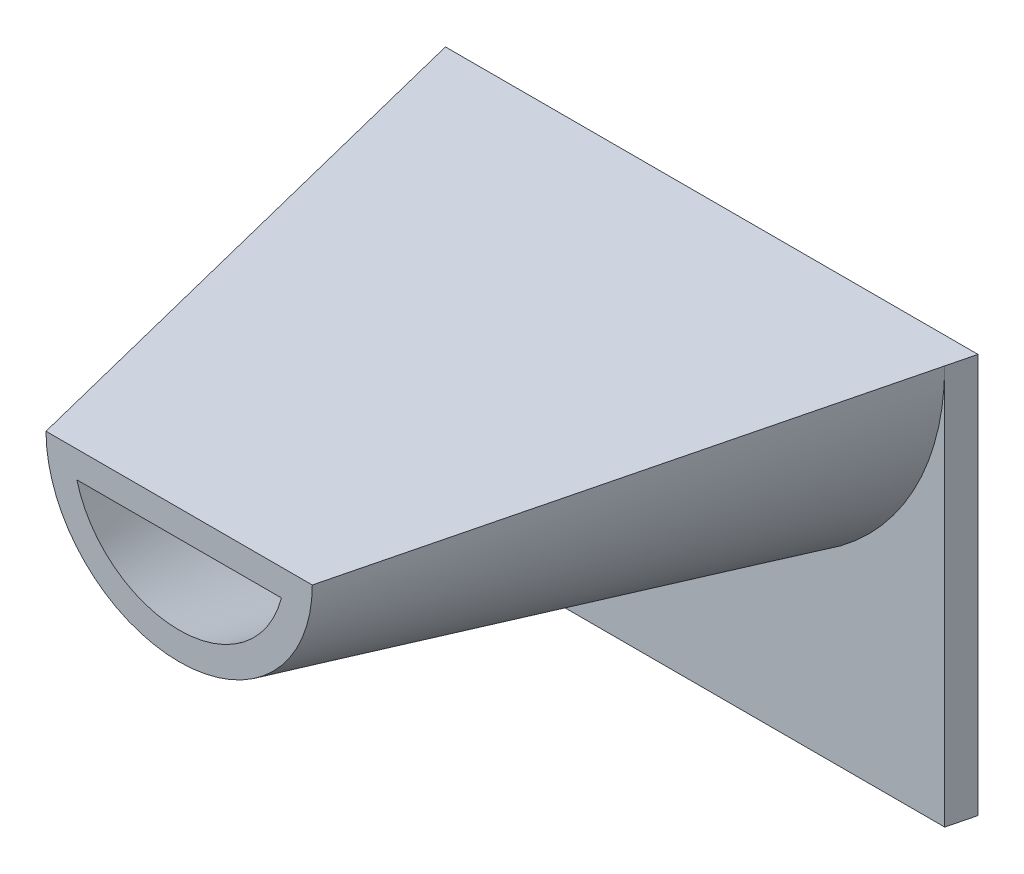
ISO-10303-21;
HEADER;
FILE_DESCRIPTION(('STEP AP214'),'2;1');
FILE_NAME('part.step','',(''),(''),'','','');
FILE_SCHEMA(('AUTOMOTIVE_DESIGN { 1 0 10303 214 1 1 1 1 }'));
ENDSEC;
DATA;
#1=APPLICATION_CONTEXT('core data for automotive mechanical design processes');
#2=APPLICATION_PROTOCOL_DEFINITION('international standard','automotive_design',2000,#1);
#3=PRODUCT_CONTEXT('',#1,'mechanical');
#4=PRODUCT('Part','Part','',(#3));
#5=PRODUCT_RELATED_PRODUCT_CATEGORY('part','',(#4));
#6=PRODUCT_DEFINITION_FORMATION('','',#4);
#7=PRODUCT_DEFINITION_CONTEXT('part definition',#1,'design');
#8=PRODUCT_DEFINITION('design','',#6,#7);
#9=PRODUCT_DEFINITION_SHAPE('','',#8);
#10=(LENGTH_UNIT() NAMED_UNIT(*) SI_UNIT(.MILLI.,.METRE.));
#11=(NAMED_UNIT(*) PLANE_ANGLE_UNIT() SI_UNIT($,.RADIAN.));
#12=(NAMED_UNIT(*) SI_UNIT($,.STERADIAN.) SOLID_ANGLE_UNIT());
#13=UNCERTAINTY_MEASURE_WITH_UNIT(LENGTH_MEASURE(1.E-05),#10,'distance_accuracy_value','');
#14=(GEOMETRIC_REPRESENTATION_CONTEXT(3) GLOBAL_UNCERTAINTY_ASSIGNED_CONTEXT((#13)) GLOBAL_UNIT_ASSIGNED_CONTEXT((#10,
#11,#12)) REPRESENTATION_CONTEXT('',''));
#15=CARTESIAN_POINT('',(0.,0.,0.));
#16=DIRECTION('',(0.,0.,1.));
#17=DIRECTION('',(1.,0.,0.));
#18=AXIS2_PLACEMENT_3D('',#15,#16,#17);
#19=CARTESIAN_POINT('',(0.,-15.,0.));
#20=DIRECTION('',(0.,1.,0.));
#21=DIRECTION('',(1.,0.,0.));
#22=AXIS2_PLACEMENT_3D('',#19,#20,#21);
#23=PLANE('',#22);
#24=DIRECTION('',(1.,0.,0.));
#25=VECTOR('',#24,1.);
#26=CARTESIAN_POINT('',(0.,-15.,1.));
#27=LINE('',#26,#25);
#28=CARTESIAN_POINT('',(-9.75,-15.,1.));
#29=VERTEX_POINT('',#28);
#30=CARTESIAN_POINT('',(9.75,-15.,1.));
#31=VERTEX_POINT('',#30);
#32=EDGE_CURVE('E240',#29,#31,#27,.T.);
#33=ORIENTED_EDGE('',*,*,#32,.F.);
#34=DIRECTION('',(0.242535625036332,0.,0.970142500145332));
#35=VECTOR('',#34,1.);
#36=CARTESIAN_POINT('',(-10.,-15.,0.));
#37=LINE('',#36,#35);
#38=CARTESIAN_POINT('',(-10.,-15.,0.));
#39=VERTEX_POINT('',#38);
#40=EDGE_CURVE('E10',#39,#29,#37,.T.);
#41=ORIENTED_EDGE('',*,*,#40,.F.);
#42=DIRECTION('',(-1.,0.,0.));
#43=VECTOR('',#42,1.);
#44=CARTESIAN_POINT('',(10.,-15.,0.));
#45=LINE('',#44,#43);
#46=CARTESIAN_POINT('',(10.,-15.,0.));
#47=VERTEX_POINT('',#46);
#48=EDGE_CURVE('E234',#47,#39,#45,.T.);
#49=ORIENTED_EDGE('',*,*,#48,.F.);
#50=DIRECTION('',(0.242535625036336,0.,-0.970142500145331));
#51=VECTOR('',#50,1.);
#52=CARTESIAN_POINT('',(9.75,-15.,1.));
#53=LINE('',#52,#51);
#54=EDGE_CURVE('E28',#31,#47,#53,.T.);
#55=ORIENTED_EDGE('',*,*,#54,.F.);
#56=EDGE_LOOP('',(#33,#41,#49,#55));
#57=FACE_BOUND('',#56,.T.);
#58=ADVANCED_FACE('F15',(#57),#23,.F.);
#59=CARTESIAN_POINT('',(-10.,-15.,0.));
#60=DIRECTION('',(-0.970142500145332,0.,0.242535625036332));
#61=DIRECTION('',(0.,1.,0.));
#62=AXIS2_PLACEMENT_3D('',#59,#60,#61);
#63=PLANE('',#62);
#64=DIRECTION('',(0.242535625036333,0.,0.970142500145332));
#65=VECTOR('',#64,1.);
#66=CARTESIAN_POINT('',(0.,0.,40.));
#67=LINE('',#66,#65);
#68=CARTESIAN_POINT('',(-10.,0.,0.));
#69=VERTEX_POINT('',#68);
#70=CARTESIAN_POINT('',(-9.75,0.,1.));
#71=VERTEX_POINT('',#70);
#72=EDGE_CURVE('E92',#69,#71,#67,.T.);
#73=ORIENTED_EDGE('',*,*,#72,.F.);
#74=DIRECTION('',(0.,1.,0.));
#75=VECTOR('',#74,1.);
#76=CARTESIAN_POINT('',(-10.,-15.,0.));
#77=LINE('',#76,#75);
#78=EDGE_CURVE('E229',#39,#69,#77,.T.);
#79=ORIENTED_EDGE('',*,*,#78,.F.);
#80=ORIENTED_EDGE('',*,*,#40,.T.);
#81=DIRECTION('',(0.,1.,0.));
#82=VECTOR('',#81,1.);
#83=CARTESIAN_POINT('',(-9.75,-15.,1.));
#84=LINE('',#83,#82);
#85=EDGE_CURVE('E244',#29,#71,#84,.T.);
#86=ORIENTED_EDGE('',*,*,#85,.T.);
#87=EDGE_LOOP('',(#73,#79,#80,#86));
#88=FACE_BOUND('',#87,.T.);
#89=ADVANCED_FACE('F196',(#88),#63,.T.);
#90=CARTESIAN_POINT('',(9.75,-15.,1.));
#91=DIRECTION('',(0.970142500145331,0.,0.242535625036335));
#92=DIRECTION('',(0.,-1.,0.));
#93=AXIS2_PLACEMENT_3D('',#90,#91,#92);
#94=PLANE('',#93);
#95=DIRECTION('',(0.242535625036336,0.,-0.970142500145331));
#96=VECTOR('',#95,1.);
#97=CARTESIAN_POINT('',(9.75,0.,1.));
#98=LINE('',#97,#96);
#99=CARTESIAN_POINT('',(9.75,0.,1.));
#100=VERTEX_POINT('',#99);
#101=CARTESIAN_POINT('',(10.,0.,0.));
#102=VERTEX_POINT('',#101);
#103=EDGE_CURVE('E83',#100,#102,#98,.T.);
#104=ORIENTED_EDGE('',*,*,#103,.F.);
#105=DIRECTION('',(0.,1.,0.));
#106=VECTOR('',#105,1.);
#107=CARTESIAN_POINT('',(9.75,-15.,1.));
#108=LINE('',#107,#106);
#109=EDGE_CURVE('E211',#31,#100,#108,.T.);
#110=ORIENTED_EDGE('',*,*,#109,.F.);
#111=ORIENTED_EDGE('',*,*,#54,.T.);
#112=DIRECTION('',(0.,1.,0.));
#113=VECTOR('',#112,1.);
#114=CARTESIAN_POINT('',(10.,-15.,0.));
#115=LINE('',#114,#113);
#116=EDGE_CURVE('E213',#47,#102,#115,.T.);
#117=ORIENTED_EDGE('',*,*,#116,.T.);
#118=EDGE_LOOP('',(#104,#110,#111,#117));
#119=FACE_BOUND('',#118,.T.);
#120=ADVANCED_FACE('F202',(#119),#94,.T.);
#121=CARTESIAN_POINT('',(0.,-15.,1.));
#122=DIRECTION('',(0.,0.,1.));
#123=DIRECTION('',(1.,0.,0.));
#124=AXIS2_PLACEMENT_3D('',#121,#122,#123);
#125=PLANE('',#124);
#126=ORIENTED_EDGE('',*,*,#109,.T.);
#127=CARTESIAN_POINT('',(0.,0.,1.));
#128=DIRECTION('',(0.,0.,-1.));
#129=DIRECTION('',(1.,0.,0.));
#130=AXIS2_PLACEMENT_3D('',#127,#128,#129);
#131=CIRCLE('',#130,9.75);
#132=EDGE_CURVE('E224',#100,#71,#131,.T.);
#133=ORIENTED_EDGE('',*,*,#132,.T.);
#134=ORIENTED_EDGE('',*,*,#85,.F.);
#135=ORIENTED_EDGE('',*,*,#32,.T.);
#136=EDGE_LOOP('',(#126,#133,#134,#135));
#137=FACE_BOUND('',#136,.T.);
#138=ADVANCED_FACE('F152',(#137),#125,.T.);
#139=CARTESIAN_POINT('',(0.,0.,31.5789629150842));
#140=DIRECTION('',(0.,-1.,0.));
#141=DIRECTION('',(0.,0.,-1.));
#142=AXIS2_PLACEMENT_3D('',#139,#140,#141);
#143=PLANE('',#142);
#144=ORIENTED_EDGE('',*,*,#72,.T.);
#145=DIRECTION('',(0.242535625036333,0.,0.970142500145332));
#146=VECTOR('',#145,1.);
#147=CARTESIAN_POINT('',(0.,0.,40.));
#148=LINE('',#147,#146);
#149=CARTESIAN_POINT('',(-5.,0.,20.));
#150=VERTEX_POINT('',#149);
#151=EDGE_CURVE('E223',#71,#150,#148,.T.);
#152=ORIENTED_EDGE('',*,*,#151,.T.);
#153=DIRECTION('',(-1.,0.,0.));
#154=VECTOR('',#153,1.);
#155=CARTESIAN_POINT('',(0.,0.,20.));
#156=LINE('',#155,#154);
#157=CARTESIAN_POINT('',(5.,0.,20.));
#158=VERTEX_POINT('',#157);
#159=EDGE_CURVE('E173',#158,#150,#156,.T.);
#160=ORIENTED_EDGE('',*,*,#159,.F.);
#161=DIRECTION('',(0.242535625036333,0.,-0.970142500145332));
#162=VECTOR('',#161,1.);
#163=CARTESIAN_POINT('',(0.,0.,40.));
#164=LINE('',#163,#162);
#165=EDGE_CURVE('E217',#158,#100,#164,.T.);
#166=ORIENTED_EDGE('',*,*,#165,.T.);
#167=ORIENTED_EDGE('',*,*,#103,.T.);
#168=DIRECTION('',(-1.,0.,0.));
#169=VECTOR('',#168,1.);
#170=CARTESIAN_POINT('',(2.34641638225249,0.,0.));
#171=LINE('',#170,#169);
#172=EDGE_CURVE('E258',#102,#69,#171,.T.);
#173=ORIENTED_EDGE('',*,*,#172,.T.);
#174=EDGE_LOOP('',(#144,#152,#160,#166,#167,#173));
#175=FACE_BOUND('',#174,.T.);
#176=ADVANCED_FACE('F192',(#175),#143,.F.);
#177=CARTESIAN_POINT('',(0.,0.,20.));
#178=DIRECTION('',(0.,0.,-1.));
#179=DIRECTION('',(-1.,0.,0.));
#180=AXIS2_PLACEMENT_3D('',#177,#178,#179);
#181=CONICAL_SURFACE('',#180,5.,0.244978663126864);
#182=ORIENTED_EDGE('',*,*,#132,.F.);
#183=ORIENTED_EDGE('',*,*,#165,.F.);
#184=CARTESIAN_POINT('',(0.,0.,20.));
#185=DIRECTION('',(0.,0.,-1.));
#186=DIRECTION('',(1.,0.,0.));
#187=AXIS2_PLACEMENT_3D('',#184,#185,#186);
#188=CIRCLE('',#187,5.);
#189=EDGE_CURVE('E247',#158,#150,#188,.T.);
#190=ORIENTED_EDGE('',*,*,#189,.T.);
#191=ORIENTED_EDGE('',*,*,#151,.F.);
#192=EDGE_LOOP('',(#182,#183,#190,#191));
#193=FACE_BOUND('',#192,.T.);
#194=ADVANCED_FACE('F17',(#193),#181,.T.);
#195=CARTESIAN_POINT('',(0.,0.,0.));
#196=DIRECTION('',(0.,0.,-1.));
#197=DIRECTION('',(0.,-1.,0.));
#198=AXIS2_PLACEMENT_3D('',#195,#196,#197);
#199=PLANE('',#198);
#200=ORIENTED_EDGE('',*,*,#172,.F.);
#201=ORIENTED_EDGE('',*,*,#116,.F.);
#202=ORIENTED_EDGE('',*,*,#48,.T.);
#203=ORIENTED_EDGE('',*,*,#78,.T.);
#204=EDGE_LOOP('',(#200,#201,#202,#203));
#205=FACE_BOUND('',#204,.T.);
#206=DIRECTION('',(-1.,0.,0.));
#207=VECTOR('',#206,1.);
#208=CARTESIAN_POINT('',(0.,-1.,0.));
#209=LINE('',#208,#207);
#210=CARTESIAN_POINT('',(8.91330308426185,-1.,0.));
#211=VERTEX_POINT('',#210);
#212=CARTESIAN_POINT('',(-8.91330308426185,-1.,0.));
#213=VERTEX_POINT('',#212);
#214=EDGE_CURVE('E113',#211,#213,#209,.T.);
#215=ORIENTED_EDGE('',*,*,#214,.T.);
#216=CARTESIAN_POINT('',(0.,0.,0.));
#217=DIRECTION('',(0.,0.,1.));
#218=DIRECTION('',(-1.,0.,0.));
#219=AXIS2_PLACEMENT_3D('',#216,#217,#218);
#220=CIRCLE('',#219,8.96922359359559);
#221=EDGE_CURVE('E101',#213,#211,#220,.T.);
#222=ORIENTED_EDGE('',*,*,#221,.T.);
#223=EDGE_LOOP('',(#215,#222));
#224=FACE_BOUND('',#223,.T.);
#225=ADVANCED_FACE('F182',(#205,#224),#199,.T.);
#226=CARTESIAN_POINT('',(0.,0.,20.));
#227=DIRECTION('',(0.,0.,-1.));
#228=DIRECTION('',(0.,-1.,0.));
#229=AXIS2_PLACEMENT_3D('',#226,#227,#228);
#230=PLANE('',#229);
#231=ORIENTED_EDGE('',*,*,#159,.T.);
#232=ORIENTED_EDGE('',*,*,#189,.F.);
#233=EDGE_LOOP('',(#231,#232));
#234=FACE_BOUND('',#233,.T.);
#235=DIRECTION('',(-1.,0.,0.));
#236=VECTOR('',#235,1.);
#237=CARTESIAN_POINT('',(8.91330308426185,-1.,20.));
#238=LINE('',#237,#236);
#239=CARTESIAN_POINT('',(3.84118939079497,-1.,20.));
#240=VERTEX_POINT('',#239);
#241=CARTESIAN_POINT('',(-3.84118939079497,-1.,20.));
#242=VERTEX_POINT('',#241);
#243=EDGE_CURVE('E110',#240,#242,#238,.T.);
#244=ORIENTED_EDGE('',*,*,#243,.F.);
#245=CARTESIAN_POINT('',(0.,0.,20.));
#246=DIRECTION('',(0.,0.,-1.));
#247=DIRECTION('',(-1.,0.,0.));
#248=AXIS2_PLACEMENT_3D('',#245,#246,#247);
#249=CIRCLE('',#248,3.96922359359559);
#250=EDGE_CURVE('E107',#240,#242,#249,.T.);
#251=ORIENTED_EDGE('',*,*,#250,.T.);
#252=EDGE_LOOP('',(#244,#251));
#253=FACE_BOUND('',#252,.T.);
#254=ADVANCED_FACE('F108',(#234,#253),#230,.F.);
#255=CARTESIAN_POINT('',(0.,0.,19.7574643749637));
#256=DIRECTION('',(0.,0.,-1.));
#257=DIRECTION('',(-1.,0.,0.));
#258=AXIS2_PLACEMENT_3D('',#255,#256,#257);
#259=CONICAL_SURFACE('',#258,4.02985749985467,0.244978663126864);
#260=CARTESIAN_POINT('',(-8.91330308426185,-1.00000000000002,0.));
#261=CARTESIAN_POINT('',(-8.67747685127175,-1.00001397279586,0.937401815049645));
#262=CARTESIAN_POINT('',(-8.44154679573115,-1.00004160457504,1.87477753528348));
#263=CARTESIAN_POINT('',(-7.98681210216558,-1.00006367793959,3.68035318288477));
#264=CARTESIAN_POINT('',(-7.76802726360459,-1.00006041628685,4.54855809706966));
#265=CARTESIAN_POINT('',(-7.34758742555247,-0.999981975945263,6.21579271049151));
#266=CARTESIAN_POINT('',(-7.14595503407516,-0.999912542058277,7.01482811055563));
#267=CARTESIAN_POINT('',(-6.75981740726949,-0.999721679102646,8.54372405183816));
#268=CARTESIAN_POINT('',(-6.5753388981013,-0.999605265556672,9.27359134238611));
#269=CARTESIAN_POINT('',(-6.14127364639306,-0.999628832981648,10.9889838001945));
#270=CARTESIAN_POINT('',(-5.89152579942012,-0.999872961133768,11.9744682200049));
#271=CARTESIAN_POINT('',(-5.41681427011361,-1.00037508253087,13.8437964264559));
#272=CARTESIAN_POINT('',(-5.19194477943078,-1.00062906400937,14.7276641326425));
#273=CARTESIAN_POINT('',(-4.76704149066476,-1.00071827117388,16.3937660223273));
#274=CARTESIAN_POINT('',(-4.56711773098086,-1.00059819064159,17.1760282349085));
#275=CARTESIAN_POINT('',(-4.19197125162448,-1.0002960234724,18.6388892281784));
#276=CARTESIAN_POINT('',(-4.01690431985521,-1.00012398659702,19.3195279761486));
#277=CARTESIAN_POINT('',(-3.84118939079498,-1.,20.));
#278=B_SPLINE_CURVE_WITH_KNOTS('',3,(#260,#261,#262,#263,#264,#265,#266,#267,#268,#269,#270,
#271,#272,#273,#274,#275,#276,#277),.UNSPECIFIED.,.F.,.F.,(4,2,2,2,2,2,2,2,4),(0.,
2.89983202103439,5.58587353274232,8.05812321898225,10.3165844224298,13.3664990952614,
16.1025718652206,18.5247875221701,20.6331652187024),.UNSPECIFIED.);
#279=EDGE_CURVE('E116',#213,#242,#278,.T.);
#280=ORIENTED_EDGE('',*,*,#279,.T.);
#281=ORIENTED_EDGE('',*,*,#250,.F.);
#282=CARTESIAN_POINT('',(3.84118939079498,-1.,20.));
#283=CARTESIAN_POINT('',(4.01689645832486,-1.00012413351817,19.3195582344319));
#284=CARTESIAN_POINT('',(4.19195552022709,-1.00029668186477,18.638949742846));
#285=CARTESIAN_POINT('',(4.56709071016674,-1.00060019285629,17.1761320694093));
#286=CARTESIAN_POINT('',(4.76701102266933,-1.00072113920603,16.3938829132015));
#287=CARTESIAN_POINT('',(5.19191194297579,-1.00063324661643,14.727789941032));
#288=CARTESIAN_POINT('',(5.41678250955811,-1.00037963658309,13.8439180952524));
#289=CARTESIAN_POINT('',(5.89150083932194,-0.999876348076128,11.9745644330983));
#290=CARTESIAN_POINT('',(6.14125442501372,-0.999630458573161,10.9890587008235));
#291=CARTESIAN_POINT('',(6.57531003983965,-0.999604132839776,9.27370613082226));
#292=CARTESIAN_POINT('',(6.75977325009813,-0.999719443279809,8.54390006021871));
#293=CARTESIAN_POINT('',(7.14589118926972,-0.999909413526736,7.015082767316));
#294=CARTESIAN_POINT('',(7.347519157271,-0.999979187790987,6.21606478693569));
#295=CARTESIAN_POINT('',(7.76796118158032,-1.00005851672589,4.54882123860621));
#296=CARTESIAN_POINT('',(7.98675261419828,-1.00006233792594,3.68058996587271));
#297=CARTESIAN_POINT('',(8.44151153162582,-1.00004121743071,1.8749178178519));
#298=CARTESIAN_POINT('',(8.67745920550193,-1.00001396078816,0.937471952857933));
#299=CARTESIAN_POINT('',(8.91330308426184,-0.999999999999978,0.));
#300=B_SPLINE_CURVE_WITH_KNOTS('',3,(#282,#283,#284,#285,#286,#287,#288,#289,#290,#291,#292,
#293,#294,#295,#296,#297,#298,#299),.UNSPECIFIED.,.F.,.F.,(4,2,2,2,2,2,2,2,4),(0.,
2.10828390793722,4.53045905518847,7.26654465606056,10.3165255378958,12.5747974335418,
15.0469932023659,17.7331162264713,20.6331652180058),.UNSPECIFIED.);
#301=EDGE_CURVE('E126',#240,#211,#300,.T.);
#302=ORIENTED_EDGE('',*,*,#301,.T.);
#303=ORIENTED_EDGE('',*,*,#221,.F.);
#304=EDGE_LOOP('',(#280,#281,#302,#303));
#305=FACE_BOUND('',#304,.T.);
#306=ADVANCED_FACE('F118',(#305),#259,.F.);
#307=CARTESIAN_POINT('',(8.91330308426185,-1.,20.));
#308=DIRECTION('',(0.,-1.,0.));
#309=DIRECTION('',(0.,0.,-1.));
#310=AXIS2_PLACEMENT_3D('',#307,#308,#309);
#311=PLANE('',#310);
#312=ORIENTED_EDGE('',*,*,#301,.F.);
#313=ORIENTED_EDGE('',*,*,#243,.T.);
#314=ORIENTED_EDGE('',*,*,#279,.F.);
#315=ORIENTED_EDGE('',*,*,#214,.F.);
#316=EDGE_LOOP('',(#312,#313,#314,#315));
#317=FACE_BOUND('',#316,.T.);
#318=ADVANCED_FACE('F125',(#317),#311,.T.);
#319=CLOSED_SHELL('',(#58,#89,#120,#138,#176,#194,#225,#254,#306,#318));
#320=MANIFOLD_SOLID_BREP('B1',#319);
#321=ADVANCED_BREP_SHAPE_REPRESENTATION('',(#18,#320),#14);
#322=SHAPE_DEFINITION_REPRESENTATION(#9,#321);
ENDSEC;
END-ISO-10303-21;
